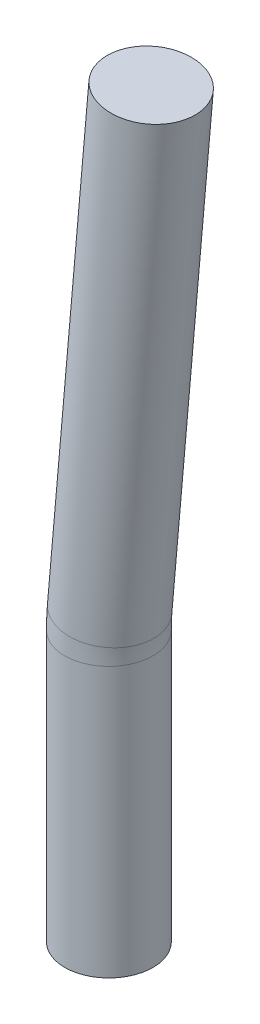
ISO-10303-21;
HEADER;
FILE_DESCRIPTION(('STEP AP214'),'2;1');
FILE_NAME('part.step','',(''),(''),'','','');
FILE_SCHEMA(('AUTOMOTIVE_DESIGN { 1 0 10303 214 1 1 1 1 }'));
ENDSEC;
DATA;
#1=APPLICATION_CONTEXT('core data for automotive mechanical design processes');
#2=APPLICATION_PROTOCOL_DEFINITION('international standard','automotive_design',2000,#1);
#3=PRODUCT_CONTEXT('',#1,'mechanical');
#4=PRODUCT('Part','Part','',(#3));
#5=PRODUCT_RELATED_PRODUCT_CATEGORY('part','',(#4));
#6=PRODUCT_DEFINITION_FORMATION('','',#4);
#7=PRODUCT_DEFINITION_CONTEXT('part definition',#1,'design');
#8=PRODUCT_DEFINITION('design','',#6,#7);
#9=PRODUCT_DEFINITION_SHAPE('','',#8);
#10=(LENGTH_UNIT() NAMED_UNIT(*) SI_UNIT(.MILLI.,.METRE.));
#11=(NAMED_UNIT(*) PLANE_ANGLE_UNIT() SI_UNIT($,.RADIAN.));
#12=(NAMED_UNIT(*) SI_UNIT($,.STERADIAN.) SOLID_ANGLE_UNIT());
#13=UNCERTAINTY_MEASURE_WITH_UNIT(LENGTH_MEASURE(1.E-05),#10,'distance_accuracy_value','');
#14=(GEOMETRIC_REPRESENTATION_CONTEXT(3) GLOBAL_UNCERTAINTY_ASSIGNED_CONTEXT((#13)) GLOBAL_UNIT_ASSIGNED_CONTEXT((#10,
#11,#12)) REPRESENTATION_CONTEXT('',''));
#15=CARTESIAN_POINT('',(0.,0.,0.));
#16=DIRECTION('',(0.,0.,1.));
#17=DIRECTION('',(1.,0.,0.));
#18=AXIS2_PLACEMENT_3D('',#15,#16,#17);
#19=CARTESIAN_POINT('',(0.,0.,0.));
#20=DIRECTION('',(0.,1.,0.));
#21=DIRECTION('',(0.,0.,1.));
#22=AXIS2_PLACEMENT_3D('',#19,#20,#21);
#23=PLANE('',#22);
#24=CARTESIAN_POINT('',(0.,0.,0.));
#25=DIRECTION('',(0.,1.,0.));
#26=DIRECTION('',(0.,0.,1.));
#27=AXIS2_PLACEMENT_3D('',#24,#25,#26);
#28=CIRCLE('',#27,3.);
#29=CARTESIAN_POINT('',(0.,0.,3.));
#30=VERTEX_POINT('',#29);
#31=EDGE_CURVE('E46',#30,#30,#28,.T.);
#32=ORIENTED_EDGE('',*,*,#31,.F.);
#33=EDGE_LOOP('',(#32));
#34=FACE_BOUND('',#33,.T.);
#35=ADVANCED_FACE('F34',(#34),#23,.F.);
#36=CARTESIAN_POINT('',(2.87613951067273,51.8744250370276,0.));
#37=DIRECTION('',(0.0871557427476587,0.996194698091746,0.));
#38=DIRECTION('',(0.,0.,1.));
#39=AXIS2_PLACEMENT_3D('',#36,#37,#38);
#40=PLANE('',#39);
#41=CARTESIAN_POINT('',(2.87613951067273,51.8744250370276,0.));
#42=DIRECTION('',(0.0871557427476587,0.996194698091746,0.));
#43=DIRECTION('',(0.,0.,1.));
#44=AXIS2_PLACEMENT_3D('',#41,#42,#43);
#45=CIRCLE('',#44,3.);
#46=CARTESIAN_POINT('',(2.87613951067273,51.8744250370276,3.));
#47=VERTEX_POINT('',#46);
#48=EDGE_CURVE('E11',#47,#47,#45,.T.);
#49=ORIENTED_EDGE('',*,*,#48,.T.);
#50=EDGE_LOOP('',(#49));
#51=FACE_BOUND('',#50,.T.);
#52=ADVANCED_FACE('F49',(#51),#40,.T.);
#53=CARTESIAN_POINT('',(0.,0.,0.));
#54=DIRECTION('',(0.,1.,0.));
#55=DIRECTION('',(0.,0.,1.));
#56=AXIS2_PLACEMENT_3D('',#53,#54,#55);
#57=CYLINDRICAL_SURFACE('',#56,3.);
#58=CARTESIAN_POINT('',(0.,18.3450858563723,0.));
#59=DIRECTION('',(0.,1.,0.));
#60=DIRECTION('',(0.,0.,1.));
#61=AXIS2_PLACEMENT_3D('',#58,#59,#60);
#62=CIRCLE('',#61,3.);
#63=CARTESIAN_POINT('',(-3.,18.3450858563723,0.));
#64=VERTEX_POINT('',#63);
#65=EDGE_CURVE('E59',#64,#64,#62,.T.);
#66=ORIENTED_EDGE('',*,*,#65,.F.);
#67=EDGE_LOOP('',(#66));
#68=FACE_BOUND('',#67,.T.);
#69=ORIENTED_EDGE('',*,*,#31,.T.);
#70=EDGE_LOOP('',(#69));
#71=FACE_BOUND('',#70,.T.);
#72=ADVANCED_FACE('F64',(#68,#71),#57,.T.);
#73=CARTESIAN_POINT('',(15.,18.3450858563723,0.));
#74=DIRECTION('',(0.,0.,-1.));
#75=DIRECTION('',(-1.,0.,0.));
#76=AXIS2_PLACEMENT_3D('',#73,#74,#75);
#77=TOROIDAL_SURFACE('',#76,15.,3.);
#78=CARTESIAN_POINT('',(0.0570795286238147,19.6524219975872,0.));
#79=DIRECTION('',(0.0871557427476586,0.996194698091746,0.));
#80=DIRECTION('',(0.,0.,1.));
#81=AXIS2_PLACEMENT_3D('',#78,#79,#80);
#82=CIRCLE('',#81,3.);
#83=CARTESIAN_POINT('',(-2.93150456565142,19.9138892258302,0.));
#84=VERTEX_POINT('',#83);
#85=EDGE_CURVE('E41',#84,#84,#82,.T.);
#86=CARTESIAN_POINT('',(15.,18.3450858563723,0.));
#87=DIRECTION('',(0.,0.,-1.));
#88=DIRECTION('',(-1.,0.,0.));
#89=AXIS2_PLACEMENT_3D('',#86,#87,#88);
#90=CIRCLE('',#89,18.);
#91=EDGE_CURVE('',#64,#84,#90,.T.);
#92=ORIENTED_EDGE('',*,*,#65,.T.);
#93=ORIENTED_EDGE('',*,*,#85,.F.);
#94=ORIENTED_EDGE('',*,*,#91,.T.);
#95=ORIENTED_EDGE('',*,*,#91,.F.);
#96=EDGE_LOOP('',(#92,#94,#93,#95));
#97=FACE_BOUND('',#96,.T.);
#98=ADVANCED_FACE('F54',(#97),#77,.T.);
#99=CARTESIAN_POINT('',(0.0570795286238147,19.6524219975872,0.));
#100=DIRECTION('',(0.0871557427476587,0.996194698091746,0.));
#101=DIRECTION('',(-0.996194698091746,0.0871557427476587,0.));
#102=AXIS2_PLACEMENT_3D('',#99,#100,#101);
#103=CYLINDRICAL_SURFACE('',#102,3.);
#104=ORIENTED_EDGE('',*,*,#48,.F.);
#105=EDGE_LOOP('',(#104));
#106=FACE_BOUND('',#105,.T.);
#107=ORIENTED_EDGE('',*,*,#85,.T.);
#108=EDGE_LOOP('',(#107));
#109=FACE_BOUND('',#108,.T.);
#110=ADVANCED_FACE('F51',(#106,#109),#103,.T.);
#111=CLOSED_SHELL('',(#35,#52,#72,#98,#110));
#112=MANIFOLD_SOLID_BREP('B2',#111);
#113=ADVANCED_BREP_SHAPE_REPRESENTATION('',(#18,#112),#14);
#114=SHAPE_DEFINITION_REPRESENTATION(#9,#113);
ENDSEC;
END-ISO-10303-21;
